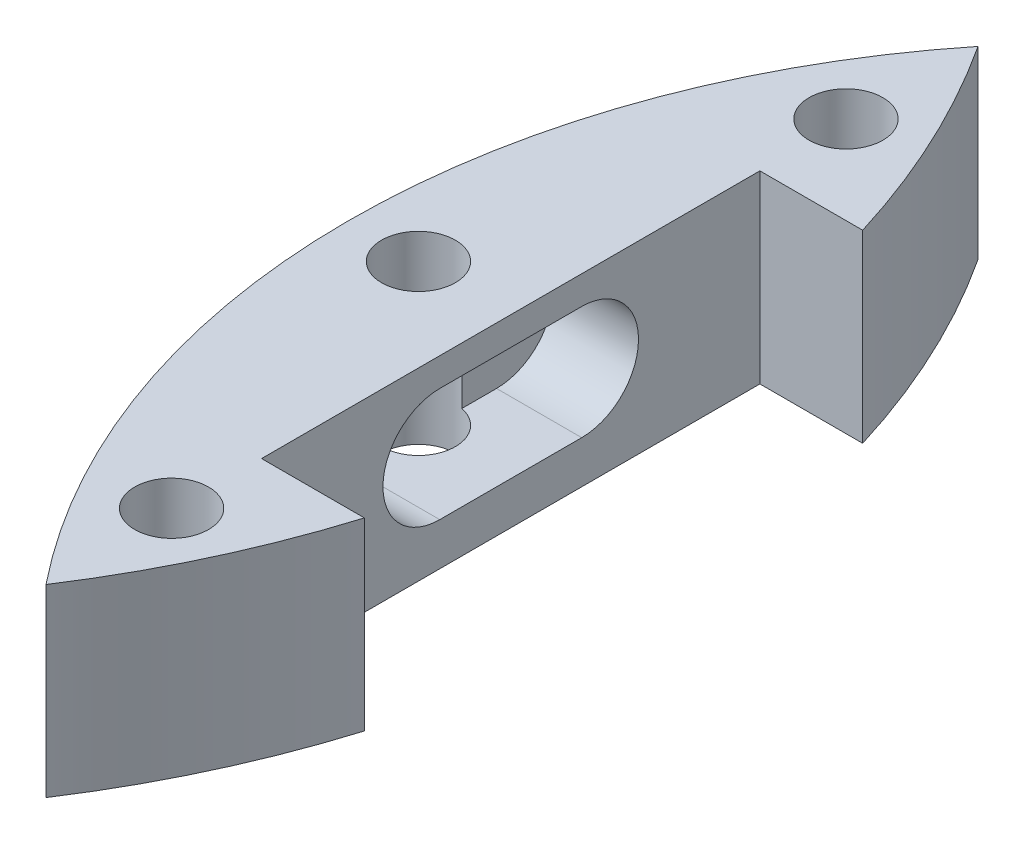
ISO-10303-21;
HEADER;
FILE_DESCRIPTION(('STEP AP214'),'2;1');
FILE_NAME('part.step','',(''),(''),'','','');
FILE_SCHEMA(('AUTOMOTIVE_DESIGN { 1 0 10303 214 1 1 1 1 }'));
ENDSEC;
DATA;
#1=APPLICATION_CONTEXT('core data for automotive mechanical design processes');
#2=APPLICATION_PROTOCOL_DEFINITION('international standard','automotive_design',2000,#1);
#3=PRODUCT_CONTEXT('',#1,'mechanical');
#4=PRODUCT('Part','Part','',(#3));
#5=PRODUCT_RELATED_PRODUCT_CATEGORY('part','',(#4));
#6=PRODUCT_DEFINITION_FORMATION('','',#4);
#7=PRODUCT_DEFINITION_CONTEXT('part definition',#1,'design');
#8=PRODUCT_DEFINITION('design','',#6,#7);
#9=PRODUCT_DEFINITION_SHAPE('','',#8);
#10=(LENGTH_UNIT() NAMED_UNIT(*) SI_UNIT(.MILLI.,.METRE.));
#11=(NAMED_UNIT(*) PLANE_ANGLE_UNIT() SI_UNIT($,.RADIAN.));
#12=(NAMED_UNIT(*) SI_UNIT($,.STERADIAN.) SOLID_ANGLE_UNIT());
#13=UNCERTAINTY_MEASURE_WITH_UNIT(LENGTH_MEASURE(1.E-05),#10,'distance_accuracy_value','');
#14=(GEOMETRIC_REPRESENTATION_CONTEXT(3) GLOBAL_UNCERTAINTY_ASSIGNED_CONTEXT((#13)) GLOBAL_UNIT_ASSIGNED_CONTEXT((#10,
#11,#12)) REPRESENTATION_CONTEXT('',''));
#15=CARTESIAN_POINT('',(0.,0.,0.));
#16=DIRECTION('',(0.,0.,1.));
#17=DIRECTION('',(1.,0.,0.));
#18=AXIS2_PLACEMENT_3D('',#15,#16,#17);
#19=CARTESIAN_POINT('',(-47.5,13.,0.));
#20=DIRECTION('',(0.,-1.,0.));
#21=DIRECTION('',(0.,0.,-1.));
#22=AXIS2_PLACEMENT_3D('',#19,#20,#21);
#23=CYLINDRICAL_SURFACE('',#22,2.6);
#24=CARTESIAN_POINT('',(-47.5,13.,0.));
#25=DIRECTION('',(0.,1.,0.));
#26=DIRECTION('',(0.,0.,1.));
#27=AXIS2_PLACEMENT_3D('',#24,#25,#26);
#28=CIRCLE('',#27,2.6);
#29=CARTESIAN_POINT('',(-47.5,13.,2.6));
#30=VERTEX_POINT('',#29);
#31=EDGE_CURVE('E191',#30,#30,#28,.T.);
#32=ORIENTED_EDGE('',*,*,#31,.T.);
#33=EDGE_LOOP('',(#32));
#34=FACE_BOUND('',#33,.T.);
#35=CARTESIAN_POINT('',(-47.5,0.,0.));
#36=DIRECTION('',(0.,1.,0.));
#37=DIRECTION('',(0.,0.,1.));
#38=AXIS2_PLACEMENT_3D('',#35,#36,#37);
#39=CIRCLE('',#38,2.6);
#40=CARTESIAN_POINT('',(-47.5,0.,2.6));
#41=VERTEX_POINT('',#40);
#42=EDGE_CURVE('E215',#41,#41,#39,.T.);
#43=ORIENTED_EDGE('',*,*,#42,.F.);
#44=EDGE_LOOP('',(#43));
#45=FACE_BOUND('',#44,.T.);
#46=CARTESIAN_POINT('',(-47.5,11.,0.));
#47=DIRECTION('',(0.,1.,0.));
#48=DIRECTION('',(0.,0.,1.));
#49=AXIS2_PLACEMENT_3D('',#46,#47,#48);
#50=CIRCLE('',#49,2.6);
#51=CARTESIAN_POINT('',(-47.,11.,2.55147016443461));
#52=VERTEX_POINT('',#51);
#53=CARTESIAN_POINT('',(-47.,11.,-2.55147016443461));
#54=VERTEX_POINT('',#53);
#55=EDGE_CURVE('E170',#52,#54,#50,.T.);
#56=ORIENTED_EDGE('',*,*,#55,.F.);
#57=DIRECTION('',(0.,-1.,0.));
#58=VECTOR('',#57,1.);
#59=CARTESIAN_POINT('',(-47.,13.,2.55147016443461));
#60=LINE('',#59,#58);
#61=CARTESIAN_POINT('',(-47.,3.,2.55147016443461));
#62=VERTEX_POINT('',#61);
#63=EDGE_CURVE('E11',#52,#62,#60,.T.);
#64=ORIENTED_EDGE('',*,*,#63,.T.);
#65=CARTESIAN_POINT('',(-47.5,3.,0.));
#66=DIRECTION('',(0.,-1.,0.));
#67=DIRECTION('',(0.,0.,-1.));
#68=AXIS2_PLACEMENT_3D('',#65,#66,#67);
#69=CIRCLE('',#68,2.6);
#70=CARTESIAN_POINT('',(-47.,3.,-2.55147016443461));
#71=VERTEX_POINT('',#70);
#72=EDGE_CURVE('E142',#71,#62,#69,.T.);
#73=ORIENTED_EDGE('',*,*,#72,.F.);
#74=DIRECTION('',(0.,-1.,0.));
#75=VECTOR('',#74,1.);
#76=CARTESIAN_POINT('',(-47.,13.,-2.55147016443461));
#77=LINE('',#76,#75);
#78=EDGE_CURVE('E47',#71,#54,#77,.F.);
#79=ORIENTED_EDGE('',*,*,#78,.T.);
#80=EDGE_LOOP('',(#56,#64,#73,#79));
#81=FACE_BOUND('',#80,.T.);
#82=ADVANCED_FACE('F39',(#34,#45,#81),#23,.F.);
#83=CARTESIAN_POINT('',(0.,13.,-17.55));
#84=DIRECTION('',(0.,0.,1.));
#85=DIRECTION('',(1.,0.,0.));
#86=AXIS2_PLACEMENT_3D('',#83,#84,#85);
#87=PLANE('',#86);
#88=DIRECTION('',(-1.,0.,0.));
#89=VECTOR('',#88,1.);
#90=CARTESIAN_POINT('',(0.,0.,-17.55));
#91=LINE('',#90,#89);
#92=CARTESIAN_POINT('',(-33.7602753147711,0.,-17.55));
#93=VERTEX_POINT('',#92);
#94=CARTESIAN_POINT('',(-41.,0.,-17.55));
#95=VERTEX_POINT('',#94);
#96=EDGE_CURVE('E172',#93,#95,#91,.T.);
#97=ORIENTED_EDGE('',*,*,#96,.F.);
#98=DIRECTION('',(0.,-1.,0.));
#99=VECTOR('',#98,1.);
#100=CARTESIAN_POINT('',(-33.7602753147711,13.,-17.55));
#101=LINE('',#100,#99);
#102=CARTESIAN_POINT('',(-33.7602753147711,13.,-17.55));
#103=VERTEX_POINT('',#102);
#104=EDGE_CURVE('E232',#103,#93,#101,.T.);
#105=ORIENTED_EDGE('',*,*,#104,.F.);
#106=DIRECTION('',(-1.,0.,0.));
#107=VECTOR('',#106,1.);
#108=CARTESIAN_POINT('',(0.,13.,-17.55));
#109=LINE('',#108,#107);
#110=CARTESIAN_POINT('',(-41.,13.,-17.55));
#111=VERTEX_POINT('',#110);
#112=EDGE_CURVE('E173',#103,#111,#109,.T.);
#113=ORIENTED_EDGE('',*,*,#112,.T.);
#114=DIRECTION('',(0.,-1.,0.));
#115=VECTOR('',#114,1.);
#116=CARTESIAN_POINT('',(-41.,13.,-17.55));
#117=LINE('',#116,#115);
#118=EDGE_CURVE('E197',#111,#95,#117,.T.);
#119=ORIENTED_EDGE('',*,*,#118,.T.);
#120=EDGE_LOOP('',(#97,#105,#113,#119));
#121=FACE_BOUND('',#120,.T.);
#122=ADVANCED_FACE('F41',(#121),#87,.T.);
#123=CARTESIAN_POINT('',(-91.1362066797607,13.,-1.28369537222284E-13));
#124=DIRECTION('',(0.,-1.,0.));
#125=DIRECTION('',(0.,0.,-1.));
#126=AXIS2_PLACEMENT_3D('',#123,#124,#125);
#127=CYLINDRICAL_SURFACE('',#126,60.);
#128=CARTESIAN_POINT('',(-91.1362066797607,0.,-1.28369537222284E-13));
#129=DIRECTION('',(0.,1.,0.));
#130=DIRECTION('',(0.,0.,1.));
#131=AXIS2_PLACEMENT_3D('',#128,#129,#130);
#132=CIRCLE('',#131,60.);
#133=CARTESIAN_POINT('',(-40.9102536721667,0.,-32.8230657385773));
#134=VERTEX_POINT('',#133);
#135=EDGE_CURVE('E200',#93,#134,#132,.T.);
#136=ORIENTED_EDGE('',*,*,#135,.T.);
#137=DIRECTION('',(0.,-1.,0.));
#138=VECTOR('',#137,1.);
#139=CARTESIAN_POINT('',(-40.9102536721667,13.,-32.8230657385773));
#140=LINE('',#139,#138);
#141=CARTESIAN_POINT('',(-40.9102536721667,13.,-32.8230657385773));
#142=VERTEX_POINT('',#141);
#143=EDGE_CURVE('E229',#142,#134,#140,.T.);
#144=ORIENTED_EDGE('',*,*,#143,.F.);
#145=CARTESIAN_POINT('',(-91.1362066797607,13.,-1.28369537222284E-13));
#146=DIRECTION('',(0.,1.,0.));
#147=DIRECTION('',(0.,0.,1.));
#148=AXIS2_PLACEMENT_3D('',#145,#146,#147);
#149=CIRCLE('',#148,60.);
#150=EDGE_CURVE('E176',#103,#142,#149,.T.);
#151=ORIENTED_EDGE('',*,*,#150,.F.);
#152=ORIENTED_EDGE('',*,*,#104,.T.);
#153=EDGE_LOOP('',(#136,#144,#151,#152));
#154=FACE_BOUND('',#153,.T.);
#155=ADVANCED_FACE('F282',(#154),#127,.T.);
#156=CARTESIAN_POINT('',(0.,13.,0.));
#157=DIRECTION('',(0.,-1.,0.));
#158=DIRECTION('',(0.,0.,-1.));
#159=AXIS2_PLACEMENT_3D('',#156,#157,#158);
#160=CYLINDRICAL_SURFACE('',#159,52.45);
#161=CARTESIAN_POINT('',(0.,0.,0.));
#162=DIRECTION('',(0.,1.,0.));
#163=DIRECTION('',(0.,0.,1.));
#164=AXIS2_PLACEMENT_3D('',#161,#162,#163);
#165=CIRCLE('',#164,52.45);
#166=CARTESIAN_POINT('',(-40.9102536721668,0.,32.8230657385772));
#167=VERTEX_POINT('',#166);
#168=EDGE_CURVE('E202',#134,#167,#165,.T.);
#169=ORIENTED_EDGE('',*,*,#168,.T.);
#170=DIRECTION('',(0.,-1.,0.));
#171=VECTOR('',#170,1.);
#172=CARTESIAN_POINT('',(-40.9102536721668,13.,32.8230657385772));
#173=LINE('',#172,#171);
#174=CARTESIAN_POINT('',(-40.9102536721668,13.,32.8230657385772));
#175=VERTEX_POINT('',#174);
#176=EDGE_CURVE('E226',#175,#167,#173,.T.);
#177=ORIENTED_EDGE('',*,*,#176,.F.);
#178=CARTESIAN_POINT('',(0.,13.,0.));
#179=DIRECTION('',(0.,1.,0.));
#180=DIRECTION('',(0.,0.,1.));
#181=AXIS2_PLACEMENT_3D('',#178,#179,#180);
#182=CIRCLE('',#181,52.45);
#183=EDGE_CURVE('E179',#142,#175,#182,.T.);
#184=ORIENTED_EDGE('',*,*,#183,.F.);
#185=ORIENTED_EDGE('',*,*,#143,.T.);
#186=EDGE_LOOP('',(#169,#177,#184,#185));
#187=FACE_BOUND('',#186,.T.);
#188=ADVANCED_FACE('F278',(#187),#160,.T.);
#189=CARTESIAN_POINT('',(-91.1362066797607,13.,-1.28369537222284E-13));
#190=DIRECTION('',(0.,-1.,0.));
#191=DIRECTION('',(0.,0.,-1.));
#192=AXIS2_PLACEMENT_3D('',#189,#190,#191);
#193=CYLINDRICAL_SURFACE('',#192,60.);
#194=CARTESIAN_POINT('',(-91.1362066797607,0.,-1.28369537222284E-13));
#195=DIRECTION('',(0.,1.,0.));
#196=DIRECTION('',(0.,0.,1.));
#197=AXIS2_PLACEMENT_3D('',#194,#195,#196);
#198=CIRCLE('',#197,60.);
#199=CARTESIAN_POINT('',(-33.7602753147711,0.,17.55));
#200=VERTEX_POINT('',#199);
#201=EDGE_CURVE('E204',#167,#200,#198,.T.);
#202=ORIENTED_EDGE('',*,*,#201,.T.);
#203=DIRECTION('',(0.,-1.,0.));
#204=VECTOR('',#203,1.);
#205=CARTESIAN_POINT('',(-33.7602753147711,13.,17.55));
#206=LINE('',#205,#204);
#207=CARTESIAN_POINT('',(-33.7602753147711,13.,17.55));
#208=VERTEX_POINT('',#207);
#209=EDGE_CURVE('E223',#208,#200,#206,.T.);
#210=ORIENTED_EDGE('',*,*,#209,.F.);
#211=CARTESIAN_POINT('',(-91.1362066797607,13.,-1.28369537222284E-13));
#212=DIRECTION('',(0.,1.,0.));
#213=DIRECTION('',(0.,0.,1.));
#214=AXIS2_PLACEMENT_3D('',#211,#212,#213);
#215=CIRCLE('',#214,60.);
#216=EDGE_CURVE('E181',#175,#208,#215,.T.);
#217=ORIENTED_EDGE('',*,*,#216,.F.);
#218=ORIENTED_EDGE('',*,*,#176,.T.);
#219=EDGE_LOOP('',(#202,#210,#217,#218));
#220=FACE_BOUND('',#219,.T.);
#221=ADVANCED_FACE('F275',(#220),#193,.T.);
#222=CARTESIAN_POINT('',(0.,13.,17.55));
#223=DIRECTION('',(0.,0.,1.));
#224=DIRECTION('',(1.,0.,0.));
#225=AXIS2_PLACEMENT_3D('',#222,#223,#224);
#226=PLANE('',#225);
#227=DIRECTION('',(-1.,0.,0.));
#228=VECTOR('',#227,1.);
#229=CARTESIAN_POINT('',(0.,0.,17.55));
#230=LINE('',#229,#228);
#231=CARTESIAN_POINT('',(-41.,0.,17.55));
#232=VERTEX_POINT('',#231);
#233=EDGE_CURVE('E206',#200,#232,#230,.T.);
#234=ORIENTED_EDGE('',*,*,#233,.T.);
#235=DIRECTION('',(0.,-1.,0.));
#236=VECTOR('',#235,1.);
#237=CARTESIAN_POINT('',(-41.,13.,17.55));
#238=LINE('',#237,#236);
#239=CARTESIAN_POINT('',(-41.,13.,17.55));
#240=VERTEX_POINT('',#239);
#241=EDGE_CURVE('E221',#240,#232,#238,.T.);
#242=ORIENTED_EDGE('',*,*,#241,.F.);
#243=DIRECTION('',(-1.,0.,0.));
#244=VECTOR('',#243,1.);
#245=CARTESIAN_POINT('',(0.,13.,17.55));
#246=LINE('',#245,#244);
#247=EDGE_CURVE('E183',#208,#240,#246,.T.);
#248=ORIENTED_EDGE('',*,*,#247,.F.);
#249=ORIENTED_EDGE('',*,*,#209,.T.);
#250=EDGE_LOOP('',(#234,#242,#248,#249));
#251=FACE_BOUND('',#250,.T.);
#252=ADVANCED_FACE('F273',(#251),#226,.F.);
#253=CARTESIAN_POINT('',(-41.1362066797607,13.,-23.7500000000003));
#254=DIRECTION('',(0.,-1.,0.));
#255=DIRECTION('',(0.,0.,-1.));
#256=AXIS2_PLACEMENT_3D('',#253,#254,#255);
#257=CYLINDRICAL_SURFACE('',#256,2.60000000000001);
#258=CARTESIAN_POINT('',(-41.1362066797607,13.,-23.7500000000003));
#259=DIRECTION('',(0.,1.,0.));
#260=DIRECTION('',(0.,0.,1.));
#261=AXIS2_PLACEMENT_3D('',#258,#259,#260);
#262=CIRCLE('',#261,2.60000000000001);
#263=CARTESIAN_POINT('',(-41.1362066797607,13.,-26.3500000000003));
#264=VERTEX_POINT('',#263);
#265=EDGE_CURVE('E188',#264,#264,#262,.T.);
#266=CARTESIAN_POINT('',(-41.1362066797607,0.,-23.7500000000003));
#267=DIRECTION('',(0.,1.,0.));
#268=DIRECTION('',(0.,0.,1.));
#269=AXIS2_PLACEMENT_3D('',#266,#267,#268);
#270=CIRCLE('',#269,2.60000000000001);
#271=CARTESIAN_POINT('',(-41.1362066797607,0.,-26.3500000000003));
#272=VERTEX_POINT('',#271);
#273=EDGE_CURVE('E212',#272,#272,#270,.T.);
#274=CARTESIAN_POINT('',(-41.1362066797607,13.,-26.3500000000003));
#275=CARTESIAN_POINT('',(-41.1362066797607,12.8645833333333,-26.3500000000003));
#276=CARTESIAN_POINT('',(-41.1362066797607,12.7291666666667,-26.3500000000003));
#277=CARTESIAN_POINT('',(-41.1362066797607,12.4583333333333,-26.3500000000003));
#278=CARTESIAN_POINT('',(-41.1362066797607,12.3229166666667,-26.3500000000003));
#279=CARTESIAN_POINT('',(-41.1362066797607,12.0520833333333,-26.3500000000003));
#280=CARTESIAN_POINT('',(-41.1362066797607,11.9166666666667,-26.3500000000003));
#281=CARTESIAN_POINT('',(-41.1362066797607,11.6458333333333,-26.3500000000003));
#282=CARTESIAN_POINT('',(-41.1362066797607,11.5104166666667,-26.3500000000003));
#283=CARTESIAN_POINT('',(-41.1362066797607,11.2395833333333,-26.3500000000003));
#284=CARTESIAN_POINT('',(-41.1362066797607,11.1041666666667,-26.3500000000003));
#285=CARTESIAN_POINT('',(-41.1362066797607,10.8333333333333,-26.3500000000003));
#286=CARTESIAN_POINT('',(-41.1362066797607,10.6979166666667,-26.3500000000003));
#287=CARTESIAN_POINT('',(-41.1362066797607,10.4270833333333,-26.3500000000003));
#288=CARTESIAN_POINT('',(-41.1362066797607,10.2916666666667,-26.3500000000003));
#289=CARTESIAN_POINT('',(-41.1362066797607,10.0208333333333,-26.3500000000003));
#290=CARTESIAN_POINT('',(-41.1362066797607,9.88541666666667,-26.3500000000003));
#291=CARTESIAN_POINT('',(-41.1362066797607,9.61458333333333,-26.3500000000003));
#292=CARTESIAN_POINT('',(-41.1362066797607,9.47916666666667,-26.3500000000003));
#293=CARTESIAN_POINT('',(-41.1362066797607,9.20833333333333,-26.3500000000003));
#294=CARTESIAN_POINT('',(-41.1362066797607,9.07291666666667,-26.3500000000003));
#295=CARTESIAN_POINT('',(-41.1362066797607,8.80208333333333,-26.3500000000003));
#296=CARTESIAN_POINT('',(-41.1362066797607,8.66666666666667,-26.3500000000003));
#297=CARTESIAN_POINT('',(-41.1362066797607,8.39583333333333,-26.3500000000003));
#298=CARTESIAN_POINT('',(-41.1362066797607,8.26041666666667,-26.3500000000003));
#299=CARTESIAN_POINT('',(-41.1362066797607,7.98958333333333,-26.3500000000003));
#300=CARTESIAN_POINT('',(-41.1362066797607,7.85416666666667,-26.3500000000003));
#301=CARTESIAN_POINT('',(-41.1362066797607,7.58333333333333,-26.3500000000003));
#302=CARTESIAN_POINT('',(-41.1362066797607,7.44791666666667,-26.3500000000003));
#303=CARTESIAN_POINT('',(-41.1362066797607,7.17708333333333,-26.3500000000003));
#304=CARTESIAN_POINT('',(-41.1362066797607,7.04166666666667,-26.3500000000003));
#305=CARTESIAN_POINT('',(-41.1362066797607,6.77083333333333,-26.3500000000003));
#306=CARTESIAN_POINT('',(-41.1362066797607,6.63541666666667,-26.3500000000003));
#307=CARTESIAN_POINT('',(-41.1362066797607,6.36458333333333,-26.3500000000003));
#308=CARTESIAN_POINT('',(-41.1362066797607,6.22916666666667,-26.3500000000003));
#309=CARTESIAN_POINT('',(-41.1362066797607,5.95833333333333,-26.3500000000003));
#310=CARTESIAN_POINT('',(-41.1362066797607,5.82291666666667,-26.3500000000003));
#311=CARTESIAN_POINT('',(-41.1362066797607,5.55208333333333,-26.3500000000003));
#312=CARTESIAN_POINT('',(-41.1362066797607,5.41666666666667,-26.3500000000003));
#313=CARTESIAN_POINT('',(-41.1362066797607,5.14583333333333,-26.3500000000003));
#314=CARTESIAN_POINT('',(-41.1362066797607,5.01041666666667,-26.3500000000003));
#315=CARTESIAN_POINT('',(-41.1362066797607,4.73958333333333,-26.3500000000003));
#316=CARTESIAN_POINT('',(-41.1362066797607,4.60416666666667,-26.3500000000003));
#317=CARTESIAN_POINT('',(-41.1362066797607,4.33333333333333,-26.3500000000003));
#318=CARTESIAN_POINT('',(-41.1362066797607,4.19791666666667,-26.3500000000003));
#319=CARTESIAN_POINT('',(-41.1362066797607,3.92708333333333,-26.3500000000003));
#320=CARTESIAN_POINT('',(-41.1362066797607,3.79166666666667,-26.3500000000003));
#321=CARTESIAN_POINT('',(-41.1362066797607,3.52083333333333,-26.3500000000003));
#322=CARTESIAN_POINT('',(-41.1362066797607,3.38541666666667,-26.3500000000003));
#323=CARTESIAN_POINT('',(-41.1362066797607,3.11458333333333,-26.3500000000003));
#324=CARTESIAN_POINT('',(-41.1362066797607,2.97916666666667,-26.3500000000003));
#325=CARTESIAN_POINT('',(-41.1362066797607,2.70833333333333,-26.3500000000003));
#326=CARTESIAN_POINT('',(-41.1362066797607,2.57291666666667,-26.3500000000003));
#327=CARTESIAN_POINT('',(-41.1362066797607,2.30208333333333,-26.3500000000003));
#328=CARTESIAN_POINT('',(-41.1362066797607,2.16666666666667,-26.3500000000003));
#329=CARTESIAN_POINT('',(-41.1362066797607,1.89583333333333,-26.3500000000003));
#330=CARTESIAN_POINT('',(-41.1362066797607,1.76041666666667,-26.3500000000003));
#331=CARTESIAN_POINT('',(-41.1362066797607,1.48958333333333,-26.3500000000003));
#332=CARTESIAN_POINT('',(-41.1362066797607,1.35416666666667,-26.3500000000003));
#333=CARTESIAN_POINT('',(-41.1362066797607,1.08333333333333,-26.3500000000003));
#334=CARTESIAN_POINT('',(-41.1362066797607,0.947916666666667,-26.3500000000003));
#335=CARTESIAN_POINT('',(-41.1362066797607,0.677083333333334,-26.3500000000003));
#336=CARTESIAN_POINT('',(-41.1362066797607,0.541666666666667,-26.3500000000003));
#337=CARTESIAN_POINT('',(-41.1362066797607,0.270833333333334,-26.3500000000003));
#338=CARTESIAN_POINT('',(-41.1362066797607,0.135416666666667,-26.3500000000003));
#339=CARTESIAN_POINT('',(-41.1362066797607,0.,-26.3500000000003));
#340=B_SPLINE_CURVE_WITH_KNOTS('',3,(#274,#275,#276,#277,#278,#279,#280,#281,#282,#283,#284,
#285,#286,#287,#288,#289,#290,#291,#292,#293,#294,#295,#296,#297,#298,#299,#300,#301,#302,#303,
#304,#305,#306,#307,#308,#309,#310,#311,#312,#313,#314,#315,#316,#317,#318,#319,#320,#321,#322,
#323,#324,#325,#326,#327,#328,#329,#330,#331,#332,#333,#334,#335,#336,#337,#338,#339),
.UNSPECIFIED.,.F.,.F.,(4,2,2,2,2,2,2,2,2,2,2,2,2,2,2,2,2,2,2,2,2,2,2,2,2,2,2,2,2,2,2,2,4),(0.,
0.406249999999999,0.812499999999999,1.21875,1.625,2.03125,2.4375,2.84375,3.25,3.65625,4.0625,
4.46875,4.875,5.28125,5.6875,6.09375,6.5,6.90625,7.3125,7.71875,8.125,8.53125,8.9375,9.34375,
9.75,10.15625,10.5625,10.96875,11.375,11.78125,12.1875,12.59375,13.),.UNSPECIFIED.);
#341=EDGE_CURVE('BSEAM250',#264,#272,#340,.T.);
#342=ORIENTED_EDGE('',*,*,#265,.T.);
#343=ORIENTED_EDGE('',*,*,#273,.F.);
#344=ORIENTED_EDGE('',*,*,#341,.T.);
#345=ORIENTED_EDGE('',*,*,#341,.F.);
#346=EDGE_LOOP('',(#342,#344,#343,#345));
#347=FACE_BOUND('',#346,.T.);
#348=ADVANCED_FACE('F250',(#347),#257,.F.);
#349=CARTESIAN_POINT('',(-41.,13.,0.));
#350=DIRECTION('',(1.,0.,0.));
#351=DIRECTION('',(0.,0.,-1.));
#352=AXIS2_PLACEMENT_3D('',#349,#350,#351);
#353=PLANE('',#352);
#354=CARTESIAN_POINT('',(-41.,7.,5.));
#355=DIRECTION('',(1.,0.,0.));
#356=DIRECTION('',(0.,0.,-1.));
#357=AXIS2_PLACEMENT_3D('',#354,#355,#356);
#358=CIRCLE('',#357,4.);
#359=CARTESIAN_POINT('',(-41.,11.,5.));
#360=VERTEX_POINT('',#359);
#361=CARTESIAN_POINT('',(-41.,3.,5.));
#362=VERTEX_POINT('',#361);
#363=EDGE_CURVE('E62',#360,#362,#358,.T.);
#364=ORIENTED_EDGE('',*,*,#363,.F.);
#365=DIRECTION('',(0.,0.,1.));
#366=VECTOR('',#365,1.);
#367=CARTESIAN_POINT('',(-41.,11.,5.));
#368=LINE('',#367,#366);
#369=CARTESIAN_POINT('',(-41.,11.,-5.));
#370=VERTEX_POINT('',#369);
#371=EDGE_CURVE('E151',#370,#360,#368,.T.);
#372=ORIENTED_EDGE('',*,*,#371,.F.);
#373=CARTESIAN_POINT('',(-41.,7.,-5.));
#374=DIRECTION('',(1.,0.,0.));
#375=DIRECTION('',(0.,0.,-1.));
#376=AXIS2_PLACEMENT_3D('',#373,#374,#375);
#377=CIRCLE('',#376,4.);
#378=CARTESIAN_POINT('',(-41.,3.,-5.));
#379=VERTEX_POINT('',#378);
#380=EDGE_CURVE('E154',#379,#370,#377,.T.);
#381=ORIENTED_EDGE('',*,*,#380,.F.);
#382=DIRECTION('',(0.,0.,-1.));
#383=VECTOR('',#382,1.);
#384=CARTESIAN_POINT('',(-41.,3.,5.));
#385=LINE('',#384,#383);
#386=EDGE_CURVE('E160',#362,#379,#385,.T.);
#387=ORIENTED_EDGE('',*,*,#386,.F.);
#388=EDGE_LOOP('',(#364,#372,#381,#387));
#389=FACE_BOUND('',#388,.T.);
#390=DIRECTION('',(0.,0.,1.));
#391=VECTOR('',#390,1.);
#392=CARTESIAN_POINT('',(-41.,0.,0.));
#393=LINE('',#392,#391);
#394=EDGE_CURVE('E209',#95,#232,#393,.T.);
#395=ORIENTED_EDGE('',*,*,#394,.F.);
#396=ORIENTED_EDGE('',*,*,#118,.F.);
#397=DIRECTION('',(0.,0.,1.));
#398=VECTOR('',#397,1.);
#399=CARTESIAN_POINT('',(-41.,13.,0.));
#400=LINE('',#399,#398);
#401=EDGE_CURVE('E185',#111,#240,#400,.T.);
#402=ORIENTED_EDGE('',*,*,#401,.T.);
#403=ORIENTED_EDGE('',*,*,#241,.T.);
#404=EDGE_LOOP('',(#395,#396,#402,#403));
#405=FACE_BOUND('',#404,.T.);
#406=ADVANCED_FACE('F246',(#389,#405),#353,.T.);
#407=CARTESIAN_POINT('',(-41.1362066797608,13.,23.7500000000001));
#408=DIRECTION('',(0.,-1.,0.));
#409=DIRECTION('',(0.,0.,-1.));
#410=AXIS2_PLACEMENT_3D('',#407,#408,#409);
#411=CYLINDRICAL_SURFACE('',#410,2.59999999999999);
#412=CARTESIAN_POINT('',(-41.1362066797608,13.,23.7500000000001));
#413=DIRECTION('',(0.,1.,0.));
#414=DIRECTION('',(0.,0.,1.));
#415=AXIS2_PLACEMENT_3D('',#412,#413,#414);
#416=CIRCLE('',#415,2.59999999999999);
#417=CARTESIAN_POINT('',(-41.1362066797608,13.,21.1500000000001));
#418=VERTEX_POINT('',#417);
#419=EDGE_CURVE('E194',#418,#418,#416,.T.);
#420=CARTESIAN_POINT('',(-41.1362066797608,0.,23.7500000000001));
#421=DIRECTION('',(0.,1.,0.));
#422=DIRECTION('',(0.,0.,1.));
#423=AXIS2_PLACEMENT_3D('',#420,#421,#422);
#424=CIRCLE('',#423,2.59999999999999);
#425=CARTESIAN_POINT('',(-41.1362066797608,0.,21.1500000000001));
#426=VERTEX_POINT('',#425);
#427=EDGE_CURVE('E177',#426,#426,#424,.T.);
#428=CARTESIAN_POINT('',(-41.1362066797608,13.,21.1500000000001));
#429=CARTESIAN_POINT('',(-41.1362066797608,12.8645833333333,21.1500000000001));
#430=CARTESIAN_POINT('',(-41.1362066797608,12.7291666666667,21.1500000000001));
#431=CARTESIAN_POINT('',(-41.1362066797608,12.4583333333333,21.1500000000001));
#432=CARTESIAN_POINT('',(-41.1362066797608,12.3229166666667,21.1500000000001));
#433=CARTESIAN_POINT('',(-41.1362066797608,12.0520833333333,21.1500000000001));
#434=CARTESIAN_POINT('',(-41.1362066797608,11.9166666666667,21.1500000000001));
#435=CARTESIAN_POINT('',(-41.1362066797608,11.6458333333333,21.1500000000001));
#436=CARTESIAN_POINT('',(-41.1362066797608,11.5104166666667,21.1500000000001));
#437=CARTESIAN_POINT('',(-41.1362066797608,11.2395833333333,21.1500000000001));
#438=CARTESIAN_POINT('',(-41.1362066797608,11.1041666666667,21.1500000000001));
#439=CARTESIAN_POINT('',(-41.1362066797608,10.8333333333333,21.1500000000001));
#440=CARTESIAN_POINT('',(-41.1362066797608,10.6979166666667,21.1500000000001));
#441=CARTESIAN_POINT('',(-41.1362066797608,10.4270833333333,21.1500000000001));
#442=CARTESIAN_POINT('',(-41.1362066797608,10.2916666666667,21.1500000000001));
#443=CARTESIAN_POINT('',(-41.1362066797608,10.0208333333333,21.1500000000001));
#444=CARTESIAN_POINT('',(-41.1362066797608,9.88541666666667,21.1500000000001));
#445=CARTESIAN_POINT('',(-41.1362066797608,9.61458333333333,21.1500000000001));
#446=CARTESIAN_POINT('',(-41.1362066797608,9.47916666666667,21.1500000000001));
#447=CARTESIAN_POINT('',(-41.1362066797608,9.20833333333333,21.1500000000001));
#448=CARTESIAN_POINT('',(-41.1362066797608,9.07291666666667,21.1500000000001));
#449=CARTESIAN_POINT('',(-41.1362066797608,8.80208333333333,21.1500000000001));
#450=CARTESIAN_POINT('',(-41.1362066797608,8.66666666666667,21.1500000000001));
#451=CARTESIAN_POINT('',(-41.1362066797608,8.39583333333333,21.1500000000001));
#452=CARTESIAN_POINT('',(-41.1362066797608,8.26041666666667,21.1500000000001));
#453=CARTESIAN_POINT('',(-41.1362066797608,7.98958333333333,21.1500000000001));
#454=CARTESIAN_POINT('',(-41.1362066797608,7.85416666666667,21.1500000000001));
#455=CARTESIAN_POINT('',(-41.1362066797608,7.58333333333333,21.1500000000001));
#456=CARTESIAN_POINT('',(-41.1362066797608,7.44791666666667,21.1500000000001));
#457=CARTESIAN_POINT('',(-41.1362066797608,7.17708333333333,21.1500000000001));
#458=CARTESIAN_POINT('',(-41.1362066797608,7.04166666666667,21.1500000000001));
#459=CARTESIAN_POINT('',(-41.1362066797608,6.77083333333333,21.1500000000001));
#460=CARTESIAN_POINT('',(-41.1362066797608,6.63541666666667,21.1500000000001));
#461=CARTESIAN_POINT('',(-41.1362066797608,6.36458333333333,21.1500000000001));
#462=CARTESIAN_POINT('',(-41.1362066797608,6.22916666666667,21.1500000000001));
#463=CARTESIAN_POINT('',(-41.1362066797608,5.95833333333333,21.1500000000001));
#464=CARTESIAN_POINT('',(-41.1362066797608,5.82291666666667,21.1500000000001));
#465=CARTESIAN_POINT('',(-41.1362066797608,5.55208333333333,21.1500000000001));
#466=CARTESIAN_POINT('',(-41.1362066797608,5.41666666666667,21.1500000000001));
#467=CARTESIAN_POINT('',(-41.1362066797608,5.14583333333333,21.1500000000001));
#468=CARTESIAN_POINT('',(-41.1362066797608,5.01041666666667,21.1500000000001));
#469=CARTESIAN_POINT('',(-41.1362066797608,4.73958333333333,21.1500000000001));
#470=CARTESIAN_POINT('',(-41.1362066797608,4.60416666666667,21.1500000000001));
#471=CARTESIAN_POINT('',(-41.1362066797608,4.33333333333333,21.1500000000001));
#472=CARTESIAN_POINT('',(-41.1362066797608,4.19791666666667,21.1500000000001));
#473=CARTESIAN_POINT('',(-41.1362066797608,3.92708333333333,21.1500000000001));
#474=CARTESIAN_POINT('',(-41.1362066797608,3.79166666666667,21.1500000000001));
#475=CARTESIAN_POINT('',(-41.1362066797608,3.52083333333333,21.1500000000001));
#476=CARTESIAN_POINT('',(-41.1362066797608,3.38541666666667,21.1500000000001));
#477=CARTESIAN_POINT('',(-41.1362066797608,3.11458333333333,21.1500000000001));
#478=CARTESIAN_POINT('',(-41.1362066797608,2.97916666666667,21.1500000000001));
#479=CARTESIAN_POINT('',(-41.1362066797608,2.70833333333333,21.1500000000001));
#480=CARTESIAN_POINT('',(-41.1362066797608,2.57291666666667,21.1500000000001));
#481=CARTESIAN_POINT('',(-41.1362066797608,2.30208333333333,21.1500000000001));
#482=CARTESIAN_POINT('',(-41.1362066797608,2.16666666666667,21.1500000000001));
#483=CARTESIAN_POINT('',(-41.1362066797608,1.89583333333333,21.1500000000001));
#484=CARTESIAN_POINT('',(-41.1362066797608,1.76041666666667,21.1500000000001));
#485=CARTESIAN_POINT('',(-41.1362066797608,1.48958333333333,21.1500000000001));
#486=CARTESIAN_POINT('',(-41.1362066797608,1.35416666666667,21.1500000000001));
#487=CARTESIAN_POINT('',(-41.1362066797608,1.08333333333333,21.1500000000001));
#488=CARTESIAN_POINT('',(-41.1362066797608,0.947916666666667,21.1500000000001));
#489=CARTESIAN_POINT('',(-41.1362066797608,0.677083333333334,21.1500000000001));
#490=CARTESIAN_POINT('',(-41.1362066797608,0.541666666666667,21.1500000000001));
#491=CARTESIAN_POINT('',(-41.1362066797608,0.270833333333334,21.1500000000001));
#492=CARTESIAN_POINT('',(-41.1362066797608,0.135416666666667,21.1500000000001));
#493=CARTESIAN_POINT('',(-41.1362066797608,0.,21.1500000000001));
#494=B_SPLINE_CURVE_WITH_KNOTS('',3,(#428,#429,#430,#431,#432,#433,#434,#435,#436,#437,#438,
#439,#440,#441,#442,#443,#444,#445,#446,#447,#448,#449,#450,#451,#452,#453,#454,#455,#456,#457,
#458,#459,#460,#461,#462,#463,#464,#465,#466,#467,#468,#469,#470,#471,#472,#473,#474,#475,#476,
#477,#478,#479,#480,#481,#482,#483,#484,#485,#486,#487,#488,#489,#490,#491,#492,#493),
.UNSPECIFIED.,.F.,.F.,(4,2,2,2,2,2,2,2,2,2,2,2,2,2,2,2,2,2,2,2,2,2,2,2,2,2,2,2,2,2,2,2,4),(0.,
0.406249999999999,0.812499999999999,1.21875,1.625,2.03125,2.4375,2.84375,3.25,3.65625,4.0625,
4.46875,4.875,5.28125,5.6875,6.09375,6.5,6.90625,7.3125,7.71875,8.125,8.53125,8.9375,9.34375,
9.75,10.15625,10.5625,10.96875,11.375,11.78125,12.1875,12.59375,13.),.UNSPECIFIED.);
#495=EDGE_CURVE('BSEAM249',#418,#426,#494,.T.);
#496=ORIENTED_EDGE('',*,*,#419,.T.);
#497=ORIENTED_EDGE('',*,*,#427,.F.);
#498=ORIENTED_EDGE('',*,*,#495,.T.);
#499=ORIENTED_EDGE('',*,*,#495,.F.);
#500=EDGE_LOOP('',(#496,#498,#497,#499));
#501=FACE_BOUND('',#500,.T.);
#502=ADVANCED_FACE('F249',(#501),#411,.F.);
#503=CARTESIAN_POINT('',(0.,13.,0.));
#504=DIRECTION('',(0.,1.,0.));
#505=DIRECTION('',(0.,0.,1.));
#506=AXIS2_PLACEMENT_3D('',#503,#504,#505);
#507=PLANE('',#506);
#508=ORIENTED_EDGE('',*,*,#112,.F.);
#509=ORIENTED_EDGE('',*,*,#150,.T.);
#510=ORIENTED_EDGE('',*,*,#183,.T.);
#511=ORIENTED_EDGE('',*,*,#216,.T.);
#512=ORIENTED_EDGE('',*,*,#247,.T.);
#513=ORIENTED_EDGE('',*,*,#401,.F.);
#514=EDGE_LOOP('',(#508,#509,#510,#511,#512,#513));
#515=FACE_BOUND('',#514,.T.);
#516=ORIENTED_EDGE('',*,*,#265,.F.);
#517=EDGE_LOOP('',(#516));
#518=FACE_BOUND('',#517,.T.);
#519=ORIENTED_EDGE('',*,*,#31,.F.);
#520=EDGE_LOOP('',(#519));
#521=FACE_BOUND('',#520,.T.);
#522=ORIENTED_EDGE('',*,*,#419,.F.);
#523=EDGE_LOOP('',(#522));
#524=FACE_BOUND('',#523,.T.);
#525=ADVANCED_FACE('F267',(#515,#518,#521,#524),#507,.T.);
#526=CARTESIAN_POINT('',(0.,0.,0.));
#527=DIRECTION('',(0.,1.,0.));
#528=DIRECTION('',(0.,0.,1.));
#529=AXIS2_PLACEMENT_3D('',#526,#527,#528);
#530=PLANE('',#529);
#531=ORIENTED_EDGE('',*,*,#96,.T.);
#532=ORIENTED_EDGE('',*,*,#394,.T.);
#533=ORIENTED_EDGE('',*,*,#233,.F.);
#534=ORIENTED_EDGE('',*,*,#201,.F.);
#535=ORIENTED_EDGE('',*,*,#168,.F.);
#536=ORIENTED_EDGE('',*,*,#135,.F.);
#537=EDGE_LOOP('',(#531,#532,#533,#534,#535,#536));
#538=FACE_BOUND('',#537,.T.);
#539=ORIENTED_EDGE('',*,*,#273,.T.);
#540=EDGE_LOOP('',(#539));
#541=FACE_BOUND('',#540,.T.);
#542=ORIENTED_EDGE('',*,*,#42,.T.);
#543=EDGE_LOOP('',(#542));
#544=FACE_BOUND('',#543,.T.);
#545=ORIENTED_EDGE('',*,*,#427,.T.);
#546=EDGE_LOOP('',(#545));
#547=FACE_BOUND('',#546,.T.);
#548=ADVANCED_FACE('F256',(#538,#541,#544,#547),#530,.F.);
#549=CARTESIAN_POINT('',(-47.,7.,5.));
#550=DIRECTION('',(1.,0.,0.));
#551=DIRECTION('',(0.,0.,-1.));
#552=AXIS2_PLACEMENT_3D('',#549,#550,#551);
#553=PLANE('',#552);
#554=DIRECTION('',(0.,0.,1.));
#555=VECTOR('',#554,1.);
#556=CARTESIAN_POINT('',(-47.,11.,5.));
#557=LINE('',#556,#555);
#558=CARTESIAN_POINT('',(-47.,11.,5.));
#559=VERTEX_POINT('',#558);
#560=EDGE_CURVE('E149',#52,#559,#557,.T.);
#561=ORIENTED_EDGE('',*,*,#560,.T.);
#562=CARTESIAN_POINT('',(-47.,7.,5.));
#563=DIRECTION('',(1.,0.,0.));
#564=DIRECTION('',(0.,0.,-1.));
#565=AXIS2_PLACEMENT_3D('',#562,#563,#564);
#566=CIRCLE('',#565,4.);
#567=CARTESIAN_POINT('',(-47.,3.,5.));
#568=VERTEX_POINT('',#567);
#569=EDGE_CURVE('E131',#559,#568,#566,.T.);
#570=ORIENTED_EDGE('',*,*,#569,.T.);
#571=DIRECTION('',(0.,0.,-1.));
#572=VECTOR('',#571,1.);
#573=CARTESIAN_POINT('',(-47.,3.,5.));
#574=LINE('',#573,#572);
#575=EDGE_CURVE('E138',#568,#62,#574,.T.);
#576=ORIENTED_EDGE('',*,*,#575,.T.);
#577=ORIENTED_EDGE('',*,*,#63,.F.);
#578=EDGE_LOOP('',(#561,#570,#576,#577));
#579=FACE_BOUND('',#578,.T.);
#580=ADVANCED_FACE('F147',(#579),#553,.T.);
#581=CARTESIAN_POINT('',(-47.,7.,5.));
#582=DIRECTION('',(1.,0.,0.));
#583=DIRECTION('',(0.,0.,-1.));
#584=AXIS2_PLACEMENT_3D('',#581,#582,#583);
#585=CYLINDRICAL_SURFACE('',#584,4.);
#586=ORIENTED_EDGE('',*,*,#363,.T.);
#587=DIRECTION('',(1.,0.,0.));
#588=VECTOR('',#587,1.);
#589=CARTESIAN_POINT('',(-47.,3.,5.));
#590=LINE('',#589,#588);
#591=EDGE_CURVE('E127',#568,#362,#590,.T.);
#592=ORIENTED_EDGE('',*,*,#591,.F.);
#593=ORIENTED_EDGE('',*,*,#569,.F.);
#594=DIRECTION('',(1.,0.,0.));
#595=VECTOR('',#594,1.);
#596=CARTESIAN_POINT('',(-47.,11.,5.));
#597=LINE('',#596,#595);
#598=EDGE_CURVE('E164',#559,#360,#597,.T.);
#599=ORIENTED_EDGE('',*,*,#598,.T.);
#600=EDGE_LOOP('',(#586,#592,#593,#599));
#601=FACE_BOUND('',#600,.T.);
#602=ADVANCED_FACE('F129',(#601),#585,.F.);
#603=CARTESIAN_POINT('',(-47.,11.,5.));
#604=DIRECTION('',(0.,1.,0.));
#605=DIRECTION('',(0.,0.,1.));
#606=AXIS2_PLACEMENT_3D('',#603,#604,#605);
#607=PLANE('',#606);
#608=ORIENTED_EDGE('',*,*,#55,.T.);
#609=CARTESIAN_POINT('',(-47.,11.,-5.));
#610=VERTEX_POINT('',#609);
#611=EDGE_CURVE('E54',#610,#54,#557,.T.);
#612=ORIENTED_EDGE('',*,*,#611,.F.);
#613=DIRECTION('',(1.,0.,0.));
#614=VECTOR('',#613,1.);
#615=CARTESIAN_POINT('',(-47.,11.,-5.));
#616=LINE('',#615,#614);
#617=EDGE_CURVE('E166',#610,#370,#616,.T.);
#618=ORIENTED_EDGE('',*,*,#617,.T.);
#619=ORIENTED_EDGE('',*,*,#371,.T.);
#620=ORIENTED_EDGE('',*,*,#598,.F.);
#621=ORIENTED_EDGE('',*,*,#560,.F.);
#622=EDGE_LOOP('',(#608,#612,#618,#619,#620,#621));
#623=FACE_BOUND('',#622,.T.);
#624=ADVANCED_FACE('F243',(#623),#607,.F.);
#625=CARTESIAN_POINT('',(-47.,7.,-5.));
#626=DIRECTION('',(1.,0.,0.));
#627=DIRECTION('',(0.,0.,-1.));
#628=AXIS2_PLACEMENT_3D('',#625,#626,#627);
#629=CYLINDRICAL_SURFACE('',#628,4.);
#630=ORIENTED_EDGE('',*,*,#380,.T.);
#631=ORIENTED_EDGE('',*,*,#617,.F.);
#632=CARTESIAN_POINT('',(-47.,7.,-5.));
#633=DIRECTION('',(1.,0.,0.));
#634=DIRECTION('',(0.,0.,-1.));
#635=AXIS2_PLACEMENT_3D('',#632,#633,#634);
#636=CIRCLE('',#635,4.);
#637=CARTESIAN_POINT('',(-47.,3.,-5.));
#638=VERTEX_POINT('',#637);
#639=EDGE_CURVE('E144',#638,#610,#636,.T.);
#640=ORIENTED_EDGE('',*,*,#639,.F.);
#641=DIRECTION('',(1.,0.,0.));
#642=VECTOR('',#641,1.);
#643=CARTESIAN_POINT('',(-47.,3.,-5.));
#644=LINE('',#643,#642);
#645=EDGE_CURVE('E135',#638,#379,#644,.T.);
#646=ORIENTED_EDGE('',*,*,#645,.T.);
#647=EDGE_LOOP('',(#630,#631,#640,#646));
#648=FACE_BOUND('',#647,.T.);
#649=ADVANCED_FACE('F241',(#648),#629,.F.);
#650=CARTESIAN_POINT('',(-47.,3.,5.));
#651=DIRECTION('',(0.,-1.,0.));
#652=DIRECTION('',(0.,0.,-1.));
#653=AXIS2_PLACEMENT_3D('',#650,#651,#652);
#654=PLANE('',#653);
#655=ORIENTED_EDGE('',*,*,#72,.T.);
#656=ORIENTED_EDGE('',*,*,#575,.F.);
#657=ORIENTED_EDGE('',*,*,#591,.T.);
#658=ORIENTED_EDGE('',*,*,#386,.T.);
#659=ORIENTED_EDGE('',*,*,#645,.F.);
#660=EDGE_CURVE('E145',#71,#638,#574,.T.);
#661=ORIENTED_EDGE('',*,*,#660,.F.);
#662=EDGE_LOOP('',(#655,#656,#657,#658,#659,#661));
#663=FACE_BOUND('',#662,.T.);
#664=ADVANCED_FACE('F139',(#663),#654,.F.);
#665=ORIENTED_EDGE('',*,*,#660,.T.);
#666=ORIENTED_EDGE('',*,*,#639,.T.);
#667=ORIENTED_EDGE('',*,*,#611,.T.);
#668=ORIENTED_EDGE('',*,*,#78,.F.);
#669=EDGE_LOOP('',(#665,#666,#667,#668));
#670=FACE_BOUND('',#669,.T.);
#671=ADVANCED_FACE('F236',(#670),#553,.T.);
#672=CLOSED_SHELL('',(#82,#122,#155,#188,#221,#252,#348,#406,#502,#525,#548,#580,#602,#624,#649,
#664,#671));
#673=MANIFOLD_SOLID_BREP('B2',#672);
#674=ADVANCED_BREP_SHAPE_REPRESENTATION('',(#18,#673),#14);
#675=SHAPE_DEFINITION_REPRESENTATION(#9,#674);
ENDSEC;
END-ISO-10303-21;
